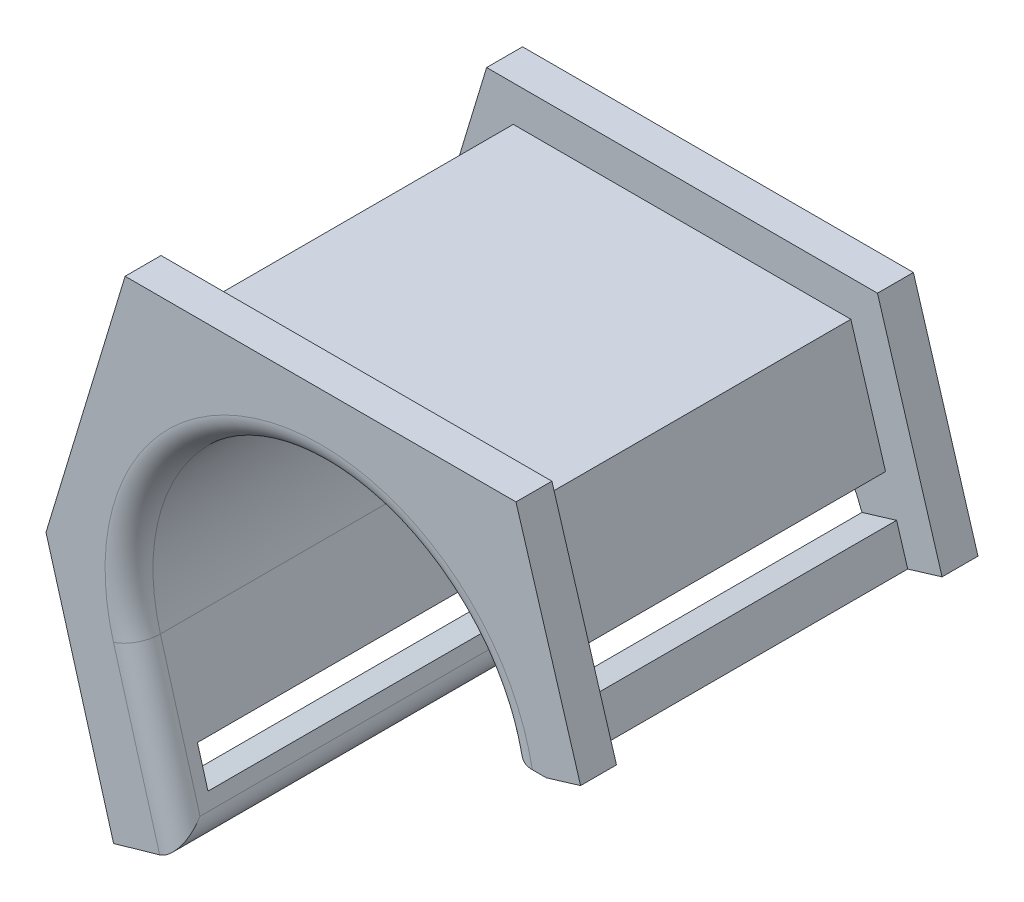
ISO-10303-21;
HEADER;
FILE_DESCRIPTION(('STEP AP214'),'2;1');
FILE_NAME('part.step','',(''),(''),'','','');
FILE_SCHEMA(('AUTOMOTIVE_DESIGN { 1 0 10303 214 1 1 1 1 }'));
ENDSEC;
DATA;
#1=APPLICATION_CONTEXT('core data for automotive mechanical design processes');
#2=APPLICATION_PROTOCOL_DEFINITION('international standard','automotive_design',2000,#1);
#3=PRODUCT_CONTEXT('',#1,'mechanical');
#4=PRODUCT('Part','Part','',(#3));
#5=PRODUCT_RELATED_PRODUCT_CATEGORY('part','',(#4));
#6=PRODUCT_DEFINITION_FORMATION('','',#4);
#7=PRODUCT_DEFINITION_CONTEXT('part definition',#1,'design');
#8=PRODUCT_DEFINITION('design','',#6,#7);
#9=PRODUCT_DEFINITION_SHAPE('','',#8);
#10=(LENGTH_UNIT() NAMED_UNIT(*) SI_UNIT(.MILLI.,.METRE.));
#11=(NAMED_UNIT(*) PLANE_ANGLE_UNIT() SI_UNIT($,.RADIAN.));
#12=(NAMED_UNIT(*) SI_UNIT($,.STERADIAN.) SOLID_ANGLE_UNIT());
#13=UNCERTAINTY_MEASURE_WITH_UNIT(LENGTH_MEASURE(1.E-05),#10,'distance_accuracy_value','');
#14=(GEOMETRIC_REPRESENTATION_CONTEXT(3) GLOBAL_UNCERTAINTY_ASSIGNED_CONTEXT((#13)) GLOBAL_UNIT_ASSIGNED_CONTEXT((#10,
#11,#12)) REPRESENTATION_CONTEXT('',''));
#15=CARTESIAN_POINT('',(0.,0.,0.));
#16=DIRECTION('',(0.,0.,1.));
#17=DIRECTION('',(1.,0.,0.));
#18=AXIS2_PLACEMENT_3D('',#15,#16,#17);
#19=CARTESIAN_POINT('',(107664.182909171,-375430.298410835,-30.4895421621525));
#20=DIRECTION('',(0.961247339593244,0.275687417422178,0.));
#21=DIRECTION('',(-0.275687417422178,0.961247339593244,0.));
#22=AXIS2_PLACEMENT_3D('',#19,#20,#21);
#23=PLANE('',#22);
#24=DIRECTION('',(-0.275687417422178,0.961247339593244,0.));
#25=VECTOR('',#24,1.);
#26=CARTESIAN_POINT('',(107664.182909171,-375430.298410835,15.1));
#27=LINE('',#26,#25);
#28=CARTESIAN_POINT('',(-7.20203780434758,-9.34776184271868,15.1));
#29=VERTEX_POINT('',#28);
#30=CARTESIAN_POINT('',(-7.64313767216152,-7.80976609922845,15.1));
#31=VERTEX_POINT('',#30);
#32=EDGE_CURVE('E265',#29,#31,#27,.T.);
#33=ORIENTED_EDGE('',*,*,#32,.T.);
#34=DIRECTION('',(0.,0.,1.));
#35=VECTOR('',#34,1.);
#36=CARTESIAN_POINT('',(-7.64313767212502,-7.80976609934137,15.1));
#37=LINE('',#36,#35);
#38=CARTESIAN_POINT('',(-7.64313767212502,-7.80976609934138,1.5));
#39=VERTEX_POINT('',#38);
#40=EDGE_CURVE('E250',#39,#31,#37,.T.);
#41=ORIENTED_EDGE('',*,*,#40,.F.);
#42=DIRECTION('',(0.275687417422178,-0.961247339593244,0.));
#43=VECTOR('',#42,1.);
#44=CARTESIAN_POINT('',(107664.182909171,-375430.298410835,1.5));
#45=LINE('',#44,#43);
#46=CARTESIAN_POINT('',(-7.20203780434758,-9.34776184271868,1.5));
#47=VERTEX_POINT('',#46);
#48=EDGE_CURVE('E300',#39,#47,#45,.T.);
#49=ORIENTED_EDGE('',*,*,#48,.T.);
#50=DIRECTION('',(0.,0.,1.));
#51=VECTOR('',#50,1.);
#52=CARTESIAN_POINT('',(-7.20203780434758,-9.34776184270447,-30.4895421621525));
#53=LINE('',#52,#51);
#54=EDGE_CURVE('E278',#47,#29,#53,.T.);
#55=ORIENTED_EDGE('',*,*,#54,.T.);
#56=EDGE_LOOP('',(#33,#41,#49,#55));
#57=FACE_BOUND('',#56,.T.);
#58=ADVANCED_FACE('F35',(#57),#23,.F.);
#59=CARTESIAN_POINT('',(114441.427485625,-378028.230173241,-30.4895421621525));
#60=DIRECTION('',(-0.957110448187778,-0.289723298976439,0.));
#61=DIRECTION('',(0.289723298976439,-0.957110448187778,0.));
#62=AXIS2_PLACEMENT_3D('',#59,#60,#61);
#63=PLANE('',#62);
#64=DIRECTION('',(-0.289723298976439,0.957110448187778,0.));
#65=VECTOR('',#64,1.);
#66=CARTESIAN_POINT('',(114441.427485625,-378028.230173241,1.5));
#67=LINE('',#66,#65);
#68=CARTESIAN_POINT('',(9.42573105153599,1.65169432477796,1.5));
#69=VERTEX_POINT('',#68);
#70=CARTESIAN_POINT('',(8.96217377317246,3.18307104191376,1.5));
#71=VERTEX_POINT('',#70);
#72=EDGE_CURVE('E279',#69,#71,#67,.T.);
#73=ORIENTED_EDGE('',*,*,#72,.T.);
#74=DIRECTION('',(0.,0.,-1.));
#75=VECTOR('',#74,1.);
#76=CARTESIAN_POINT('',(8.96217377317246,3.18307104191375,15.1));
#77=LINE('',#76,#75);
#78=CARTESIAN_POINT('',(8.96217377317246,3.18307104191375,15.1));
#79=VERTEX_POINT('',#78);
#80=EDGE_CURVE('E814',#79,#71,#77,.T.);
#81=ORIENTED_EDGE('',*,*,#80,.F.);
#82=DIRECTION('',(0.289723298976439,-0.957110448187778,0.));
#83=VECTOR('',#82,1.);
#84=CARTESIAN_POINT('',(114441.427485625,-378028.230173241,15.1));
#85=LINE('',#84,#83);
#86=CARTESIAN_POINT('',(9.42573105146494,1.65169432479217,15.1));
#87=VERTEX_POINT('',#86);
#88=EDGE_CURVE('E816',#79,#87,#85,.T.);
#89=ORIENTED_EDGE('',*,*,#88,.T.);
#90=DIRECTION('',(0.,0.,1.));
#91=VECTOR('',#90,1.);
#92=CARTESIAN_POINT('',(9.42573105146494,1.65169432479217,-30.4895421621525));
#93=LINE('',#92,#91);
#94=EDGE_CURVE('E304',#69,#87,#93,.T.);
#95=ORIENTED_EDGE('',*,*,#94,.F.);
#96=EDGE_LOOP('',(#73,#81,#89,#95));
#97=FACE_BOUND('',#96,.T.);
#98=ADVANCED_FACE('F515',(#97),#63,.F.);
#99=CARTESIAN_POINT('',(-7.20203780418057,-9.34776184266341,16.6));
#100=DIRECTION('',(-0.275687417422179,0.961247339593244,0.));
#101=DIRECTION('',(-0.961247339593244,-0.275687417422179,0.));
#102=AXIS2_PLACEMENT_3D('',#99,#100,#101);
#103=PLANE('',#102);
#104=DIRECTION('',(0.961247339593244,0.275687417422179,0.));
#105=VECTOR('',#104,1.);
#106=CARTESIAN_POINT('',(-7.20203780418057,-9.34776184266341,0.));
#107=LINE('',#106,#105);
#108=CARTESIAN_POINT('',(-8.64390881357044,-9.76129296879668,0.));
#109=VERTEX_POINT('',#108);
#110=CARTESIAN_POINT('',(-6.72141413438395,-9.20991813395232,0.));
#111=VERTEX_POINT('',#110);
#112=EDGE_CURVE('E369',#109,#111,#107,.T.);
#113=ORIENTED_EDGE('',*,*,#112,.T.);
#114=DIRECTION('',(0.,0.,-1.));
#115=VECTOR('',#114,1.);
#116=CARTESIAN_POINT('',(-6.72141413438395,-9.20991813395232,16.6));
#117=LINE('',#116,#115);
#118=CARTESIAN_POINT('',(-6.72141413438395,-9.20991813395232,16.6));
#119=VERTEX_POINT('',#118);
#120=EDGE_CURVE('E12',#111,#119,#117,.F.);
#121=ORIENTED_EDGE('',*,*,#120,.T.);
#122=DIRECTION('',(0.961247339593244,0.275687417422179,0.));
#123=VECTOR('',#122,1.);
#124=CARTESIAN_POINT('',(-7.20203780418057,-9.34776184266341,16.6));
#125=LINE('',#124,#123);
#126=CARTESIAN_POINT('',(-8.64390881357044,-9.76129296879668,16.6));
#127=VERTEX_POINT('',#126);
#128=EDGE_CURVE('E368',#127,#119,#125,.T.);
#129=ORIENTED_EDGE('',*,*,#128,.F.);
#130=DIRECTION('',(0.,0.,-1.));
#131=VECTOR('',#130,1.);
#132=CARTESIAN_POINT('',(-8.64390881357044,-9.76129296879668,47.0895421620494));
#133=LINE('',#132,#131);
#134=CARTESIAN_POINT('',(-8.64390881357044,-9.76129296879668,15.1));
#135=VERTEX_POINT('',#134);
#136=EDGE_CURVE('E355',#127,#135,#133,.T.);
#137=ORIENTED_EDGE('',*,*,#136,.T.);
#138=DIRECTION('',(0.961247339593244,0.275687417422179,0.));
#139=VECTOR('',#138,1.);
#140=CARTESIAN_POINT('',(292328.311987205,83832.9887136408,15.1));
#141=LINE('',#140,#139);
#142=EDGE_CURVE('E266',#135,#29,#141,.T.);
#143=ORIENTED_EDGE('',*,*,#142,.T.);
#144=ORIENTED_EDGE('',*,*,#54,.F.);
#145=DIRECTION('',(-0.961247339593244,-0.275687417422179,0.));
#146=VECTOR('',#145,1.);
#147=CARTESIAN_POINT('',(292328.311987205,83832.9887136408,1.5));
#148=LINE('',#147,#146);
#149=CARTESIAN_POINT('',(-8.64390881356769,-9.76129296884665,1.5));
#150=VERTEX_POINT('',#149);
#151=EDGE_CURVE('E297',#47,#150,#148,.T.);
#152=ORIENTED_EDGE('',*,*,#151,.T.);
#153=EDGE_CURVE('E319',#150,#109,#133,.T.);
#154=ORIENTED_EDGE('',*,*,#153,.T.);
#155=EDGE_LOOP('',(#113,#121,#129,#137,#143,#144,#152,#154));
#156=FACE_BOUND('',#155,.T.);
#157=ADVANCED_FACE('F422',(#156),#103,.F.);
#158=CARTESIAN_POINT('',(10.8613967238885,2.08627927332488,47.0895421620494));
#159=DIRECTION('',(-0.289723298976439,0.957110448187778,0.));
#160=DIRECTION('',(-0.957110448187778,-0.289723298976439,0.));
#161=AXIS2_PLACEMENT_3D('',#158,#159,#160);
#162=PLANE('',#161);
#163=DIRECTION('',(-0.957110448187778,-0.289723298976439,0.));
#164=VECTOR('',#163,1.);
#165=CARTESIAN_POINT('',(285567.695179607,86441.9199322144,1.5));
#166=LINE('',#165,#164);
#167=CARTESIAN_POINT('',(10.8613967238966,2.08627927328564,1.5));
#168=VERTEX_POINT('',#167);
#169=EDGE_CURVE('E282',#168,#69,#166,.T.);
#170=ORIENTED_EDGE('',*,*,#169,.T.);
#171=DIRECTION('',(0.,0.,-1.));
#172=VECTOR('',#171,1.);
#173=CARTESIAN_POINT('',(9.42573105160679,1.65169432486022,16.6));
#174=LINE('',#173,#172);
#175=CARTESIAN_POINT('',(9.42573105160679,1.65169432486022,0.));
#176=VERTEX_POINT('',#175);
#177=EDGE_CURVE('E377',#69,#176,#174,.T.);
#178=ORIENTED_EDGE('',*,*,#177,.T.);
#179=DIRECTION('',(0.957110448187778,0.289723298976439,0.));
#180=VECTOR('',#179,1.);
#181=CARTESIAN_POINT('',(10.8613967238885,2.08627927332488,0.));
#182=LINE('',#181,#180);
#183=CARTESIAN_POINT('',(10.8613967238885,2.08627927332488,0.));
#184=VERTEX_POINT('',#183);
#185=EDGE_CURVE('E315',#176,#184,#182,.T.);
#186=ORIENTED_EDGE('',*,*,#185,.T.);
#187=DIRECTION('',(0.,0.,-1.));
#188=VECTOR('',#187,1.);
#189=CARTESIAN_POINT('',(10.8613967238885,2.08627927332488,47.0895421620494));
#190=LINE('',#189,#188);
#191=EDGE_CURVE('E338',#168,#184,#190,.T.);
#192=ORIENTED_EDGE('',*,*,#191,.F.);
#193=EDGE_LOOP('',(#170,#178,#186,#192));
#194=FACE_BOUND('',#193,.T.);
#195=ADVANCED_FACE('F486',(#194),#162,.F.);
#196=CARTESIAN_POINT('',(10.8613967238885,2.08627927332488,47.0895421620494));
#197=DIRECTION('',(-0.957110448187778,-0.289723298976438,0.));
#198=DIRECTION('',(0.289723298976438,-0.957110448187778,0.));
#199=AXIS2_PLACEMENT_3D('',#196,#197,#198);
#200=PLANE('',#199);
#201=DIRECTION('',(0.289723298976439,-0.957110448187778,0.));
#202=VECTOR('',#201,1.);
#203=CARTESIAN_POINT('',(114442.863151297,-378027.795588293,1.5));
#204=LINE('',#203,#202);
#205=CARTESIAN_POINT('',(8.16315789477073,10.9999999999673,1.5));
#206=VERTEX_POINT('',#205);
#207=EDGE_CURVE('E285',#206,#168,#204,.T.);
#208=ORIENTED_EDGE('',*,*,#207,.T.);
#209=ORIENTED_EDGE('',*,*,#191,.T.);
#210=DIRECTION('',(-0.289723298976438,0.957110448187778,0.));
#211=VECTOR('',#210,1.);
#212=CARTESIAN_POINT('',(10.8613967238885,2.08627927332488,0.));
#213=LINE('',#212,#211);
#214=CARTESIAN_POINT('',(8.16315789473684,11.,0.));
#215=VERTEX_POINT('',#214);
#216=EDGE_CURVE('E331',#184,#215,#213,.T.);
#217=ORIENTED_EDGE('',*,*,#216,.T.);
#218=DIRECTION('',(0.,0.,-1.));
#219=VECTOR('',#218,1.);
#220=CARTESIAN_POINT('',(8.16315789473684,11.,47.0895421620494));
#221=LINE('',#220,#219);
#222=EDGE_CURVE('E334',#206,#215,#221,.T.);
#223=ORIENTED_EDGE('',*,*,#222,.F.);
#224=EDGE_LOOP('',(#208,#209,#217,#223));
#225=FACE_BOUND('',#224,.T.);
#226=ADVANCED_FACE('F721',(#225),#200,.F.);
#227=CARTESIAN_POINT('',(8.16315789473684,11.,47.0895421620494));
#228=DIRECTION('',(0.,-1.,0.));
#229=DIRECTION('',(0.,0.,-1.));
#230=AXIS2_PLACEMENT_3D('',#227,#228,#229);
#231=PLANE('',#230);
#232=DIRECTION('',(1.,0.,0.));
#233=VECTOR('',#232,1.);
#234=CARTESIAN_POINT('',(399999.696934181,11.0000000000241,1.5));
#235=LINE('',#234,#233);
#236=CARTESIAN_POINT('',(-8.1631578947281,11.0000000000241,1.5));
#237=VERTEX_POINT('',#236);
#238=EDGE_CURVE('E288',#237,#206,#235,.T.);
#239=ORIENTED_EDGE('',*,*,#238,.T.);
#240=ORIENTED_EDGE('',*,*,#222,.T.);
#241=DIRECTION('',(-1.,0.,0.));
#242=VECTOR('',#241,1.);
#243=CARTESIAN_POINT('',(8.16315789473684,11.,0.));
#244=LINE('',#243,#242);
#245=CARTESIAN_POINT('',(-8.16315789473684,11.,0.));
#246=VERTEX_POINT('',#245);
#247=EDGE_CURVE('E326',#215,#246,#244,.T.);
#248=ORIENTED_EDGE('',*,*,#247,.T.);
#249=DIRECTION('',(0.,0.,-1.));
#250=VECTOR('',#249,1.);
#251=CARTESIAN_POINT('',(-8.16315789473684,11.,47.0895421620494));
#252=LINE('',#251,#250);
#253=EDGE_CURVE('E329',#237,#246,#252,.T.);
#254=ORIENTED_EDGE('',*,*,#253,.F.);
#255=EDGE_LOOP('',(#239,#240,#248,#254));
#256=FACE_BOUND('',#255,.T.);
#257=ADVANCED_FACE('F547',(#256),#231,.F.);
#258=CARTESIAN_POINT('',(-8.16315789473684,11.,47.0895421620494));
#259=DIRECTION('',(0.957110448187778,-0.289723298976438,0.));
#260=DIRECTION('',(0.289723298976438,0.957110448187778,0.));
#261=AXIS2_PLACEMENT_3D('',#258,#259,#260);
#262=PLANE('',#261);
#263=DIRECTION('',(0.289723298976438,0.957110448187778,0.));
#264=VECTOR('',#263,1.);
#265=CARTESIAN_POINT('',(-47291.2420539061,-156190.206439872,1.5));
#266=LINE('',#265,#264);
#267=CARTESIAN_POINT('',(-11.4675283625161,0.0839034673276728,1.5));
#268=VERTEX_POINT('',#267);
#269=EDGE_CURVE('E291',#268,#237,#266,.T.);
#270=ORIENTED_EDGE('',*,*,#269,.T.);
#271=ORIENTED_EDGE('',*,*,#253,.T.);
#272=DIRECTION('',(-0.289723298976438,-0.957110448187778,0.));
#273=VECTOR('',#272,1.);
#274=CARTESIAN_POINT('',(-8.16315789473684,11.,0.));
#275=LINE('',#274,#273);
#276=CARTESIAN_POINT('',(-11.4675283625365,0.0839034672478182,0.));
#277=VERTEX_POINT('',#276);
#278=EDGE_CURVE('E321',#246,#277,#275,.T.);
#279=ORIENTED_EDGE('',*,*,#278,.T.);
#280=DIRECTION('',(0.,0.,-1.));
#281=VECTOR('',#280,1.);
#282=CARTESIAN_POINT('',(-11.4675283625365,0.0839034672478182,47.0895421620494));
#283=LINE('',#282,#281);
#284=EDGE_CURVE('E324',#268,#277,#283,.T.);
#285=ORIENTED_EDGE('',*,*,#284,.F.);
#286=EDGE_LOOP('',(#270,#271,#279,#285));
#287=FACE_BOUND('',#286,.T.);
#288=ADVANCED_FACE('F541',(#287),#262,.F.);
#289=CARTESIAN_POINT('',(-11.4675283625365,0.0839034672478182,47.0895421620494));
#290=DIRECTION('',(0.961247339593244,0.275687417422178,0.));
#291=DIRECTION('',(-0.275687417422178,0.961247339593244,0.));
#292=AXIS2_PLACEMENT_3D('',#289,#290,#291);
#293=PLANE('',#292);
#294=DIRECTION('',(-0.275687417422178,0.961247339593244,0.));
#295=VECTOR('',#294,1.);
#296=CARTESIAN_POINT('',(107662.741038161,-375430.711941961,1.5));
#297=LINE('',#296,#295);
#298=EDGE_CURVE('E294',#150,#268,#297,.T.);
#299=ORIENTED_EDGE('',*,*,#298,.T.);
#300=ORIENTED_EDGE('',*,*,#284,.T.);
#301=DIRECTION('',(0.275687417422178,-0.961247339593244,0.));
#302=VECTOR('',#301,1.);
#303=CARTESIAN_POINT('',(-11.4675283625365,0.0839034672478182,0.));
#304=LINE('',#303,#302);
#305=EDGE_CURVE('E316',#277,#109,#304,.T.);
#306=ORIENTED_EDGE('',*,*,#305,.T.);
#307=ORIENTED_EDGE('',*,*,#153,.F.);
#308=EDGE_LOOP('',(#299,#300,#306,#307));
#309=FACE_BOUND('',#308,.T.);
#310=ADVANCED_FACE('F420',(#309),#293,.F.);
#311=CARTESIAN_POINT('',(9.42573105160679,1.65169432486022,16.6));
#312=DIRECTION('',(0.,1.,0.));
#313=DIRECTION('',(-1.,0.,0.));
#314=AXIS2_PLACEMENT_3D('',#311,#312,#313);
#315=PLANE('',#314);
#316=DIRECTION('',(1.,0.,0.));
#317=VECTOR('',#316,1.);
#318=CARTESIAN_POINT('',(9.42573105160679,1.65169432486022,16.6));
#319=LINE('',#318,#317);
#320=CARTESIAN_POINT('',(8.84714111208952,1.65169432486022,16.6));
#321=VERTEX_POINT('',#320);
#322=CARTESIAN_POINT('',(9.42573105160679,1.65169432486022,16.6));
#323=VERTEX_POINT('',#322);
#324=EDGE_CURVE('E366',#321,#323,#319,.T.);
#325=ORIENTED_EDGE('',*,*,#324,.F.);
#326=CARTESIAN_POINT('',(8.84714111208952,1.65169432486022,16.6));
#327=CARTESIAN_POINT('',(8.80543519296856,1.65169432486022,16.5999815079966));
#328=CARTESIAN_POINT('',(8.76402836919657,1.65169432486022,16.5974882051744));
#329=CARTESIAN_POINT('',(8.68181305802902,1.65169432486022,16.5875519954981));
#330=CARTESIAN_POINT('',(8.64100456851359,1.65169432486022,16.5801091061847));
#331=CARTESIAN_POINT('',(8.60049517222724,1.65169432486022,16.5701914235928));
#332=B_SPLINE_CURVE_WITH_KNOTS('',3,(#326,#327,#328,#329,#330,#331),.UNSPECIFIED.,.F.,.F.,(4,2,
4),(0.,0.124445468075917,0.248890495139165),.UNSPECIFIED.);
#333=CARTESIAN_POINT('',(8.60049517222724,1.65169432486022,16.5701914235928));
#334=VERTEX_POINT('',#333);
#335=EDGE_CURVE('E405',#321,#334,#332,.T.);
#336=ORIENTED_EDGE('',*,*,#335,.T.);
#337=DIRECTION('',(0.,0.,-1.));
#338=VECTOR('',#337,1.);
#339=CARTESIAN_POINT('',(8.60049517222724,1.65169432486022,16.6));
#340=LINE('',#339,#338);
#341=CARTESIAN_POINT('',(8.60049517222724,1.65169432486022,0.0298085764071573));
#342=VERTEX_POINT('',#341);
#343=EDGE_CURVE('E397',#334,#342,#340,.T.);
#344=ORIENTED_EDGE('',*,*,#343,.T.);
#345=CARTESIAN_POINT('',(8.60049517222724,1.65169432486022,0.0298085764071581));
#346=CARTESIAN_POINT('',(8.64100456851359,1.65169432486022,0.0198908938153402));
#347=CARTESIAN_POINT('',(8.68181305802902,1.65169432486022,0.0124480045018923));
#348=CARTESIAN_POINT('',(8.76402836919657,1.65169432486022,0.00251179482562299));
#349=CARTESIAN_POINT('',(8.80543519296856,1.65169432486022,1.84920033517682E-05));
#350=CARTESIAN_POINT('',(8.84714111208952,1.65169432486022,0.));
#351=B_SPLINE_CURVE_WITH_KNOTS('',3,(#345,#346,#347,#348,#349,#350),.UNSPECIFIED.,.F.,.F.,(4,2,
4),(0.,0.124445027063247,0.248890495139165),.UNSPECIFIED.);
#352=CARTESIAN_POINT('',(8.84714111208952,1.65169432486022,0.));
#353=VERTEX_POINT('',#352);
#354=EDGE_CURVE('E399',#342,#353,#351,.T.);
#355=ORIENTED_EDGE('',*,*,#354,.T.);
#356=DIRECTION('',(1.,0.,0.));
#357=VECTOR('',#356,1.);
#358=CARTESIAN_POINT('',(9.42573105160679,1.65169432486022,0.));
#359=LINE('',#358,#357);
#360=EDGE_CURVE('E342',#353,#176,#359,.T.);
#361=ORIENTED_EDGE('',*,*,#360,.T.);
#362=ORIENTED_EDGE('',*,*,#177,.F.);
#363=ORIENTED_EDGE('',*,*,#94,.T.);
#364=EDGE_CURVE('E378',#323,#87,#174,.T.);
#365=ORIENTED_EDGE('',*,*,#364,.F.);
#366=EDGE_LOOP('',(#325,#336,#344,#355,#361,#362,#363,#365));
#367=FACE_BOUND('',#366,.T.);
#368=ADVANCED_FACE('F414',(#367),#315,.F.);
#369=CARTESIAN_POINT('',(-5.76016679479071,-8.93423071653014,16.6));
#370=DIRECTION('',(-0.961247339593244,-0.275687417422178,0.));
#371=DIRECTION('',(0.275687417422178,-0.961247339593244,0.));
#372=AXIS2_PLACEMENT_3D('',#369,#370,#371);
#373=PLANE('',#372);
#374=DIRECTION('',(0.,0.,-1.));
#375=VECTOR('',#374,1.);
#376=CARTESIAN_POINT('',(-7.68997871674596,-2.20549933937742,16.6));
#377=LINE('',#376,#375);
#378=CARTESIAN_POINT('',(-7.68997871674596,-2.20549933937742,15.6));
#379=VERTEX_POINT('',#378);
#380=CARTESIAN_POINT('',(-7.68997871674596,-2.20549933937742,1.));
#381=VERTEX_POINT('',#380);
#382=EDGE_CURVE('E372',#379,#381,#377,.T.);
#383=ORIENTED_EDGE('',*,*,#382,.F.);
#384=DIRECTION('',(-0.275687417422178,0.961247339593244,0.));
#385=VECTOR('',#384,1.);
#386=CARTESIAN_POINT('',(-5.76016679479071,-8.93423071653014,15.6));
#387=LINE('',#386,#385);
#388=CARTESIAN_POINT('',(-6.03585421221288,-7.9729833769369,15.6));
#389=VERTEX_POINT('',#388);
#390=EDGE_CURVE('E390',#379,#389,#387,.F.);
#391=ORIENTED_EDGE('',*,*,#390,.T.);
#392=DIRECTION('',(0.,0.,-1.));
#393=VECTOR('',#392,1.);
#394=CARTESIAN_POINT('',(-6.03585421221288,-7.9729833769369,16.6));
#395=LINE('',#394,#393);
#396=CARTESIAN_POINT('',(-6.03585421221288,-7.9729833769369,1.));
#397=VERTEX_POINT('',#396);
#398=EDGE_CURVE('E386',#389,#397,#395,.T.);
#399=ORIENTED_EDGE('',*,*,#398,.T.);
#400=DIRECTION('',(-0.275687417422178,0.961247339593244,0.));
#401=VECTOR('',#400,1.);
#402=CARTESIAN_POINT('',(-5.76016679479071,-8.93423071653014,1.));
#403=LINE('',#402,#401);
#404=EDGE_CURVE('E388',#397,#381,#403,.T.);
#405=ORIENTED_EDGE('',*,*,#404,.T.);
#406=EDGE_LOOP('',(#383,#391,#399,#405));
#407=FACE_BOUND('',#406,.T.);
#408=DIRECTION('',(0.,0.,-1.));
#409=VECTOR('',#408,1.);
#410=CARTESIAN_POINT('',(-6.20126666266423,-7.39623497318777,15.1));
#411=LINE('',#410,#409);
#412=CARTESIAN_POINT('',(-6.20126666266423,-7.39623497318777,15.1));
#413=VERTEX_POINT('',#412);
#414=CARTESIAN_POINT('',(-6.20126666266423,-7.39623497318777,1.5));
#415=VERTEX_POINT('',#414);
#416=EDGE_CURVE('E867',#413,#415,#411,.T.);
#417=ORIENTED_EDGE('',*,*,#416,.F.);
#418=DIRECTION('',(0.275687417422178,-0.961247339593244,0.));
#419=VECTOR('',#418,1.);
#420=CARTESIAN_POINT('',(-6.64236653053972,-5.85823922983857,15.1));
#421=LINE('',#420,#419);
#422=CARTESIAN_POINT('',(-6.64236653053972,-5.85823922983858,15.1));
#423=VERTEX_POINT('',#422);
#424=EDGE_CURVE('E856',#423,#413,#421,.T.);
#425=ORIENTED_EDGE('',*,*,#424,.F.);
#426=DIRECTION('',(0.,0.,1.));
#427=VECTOR('',#426,1.);
#428=CARTESIAN_POINT('',(-6.64236653053972,-5.85823922983858,15.1));
#429=LINE('',#428,#427);
#430=CARTESIAN_POINT('',(-6.64236653053972,-5.85823922983858,1.5));
#431=VERTEX_POINT('',#430);
#432=EDGE_CURVE('E245',#431,#423,#429,.T.);
#433=ORIENTED_EDGE('',*,*,#432,.F.);
#434=DIRECTION('',(-0.275687417422178,0.961247339593244,0.));
#435=VECTOR('',#434,1.);
#436=CARTESIAN_POINT('',(-6.64236653053972,-5.85823922983858,1.5));
#437=LINE('',#436,#435);
#438=EDGE_CURVE('E864',#415,#431,#437,.T.);
#439=ORIENTED_EDGE('',*,*,#438,.F.);
#440=EDGE_LOOP('',(#417,#425,#433,#439));
#441=FACE_BOUND('',#440,.T.);
#442=ADVANCED_FACE('F419',(#407,#441),#373,.F.);
#443=CARTESIAN_POINT('',(0.,0.,16.6));
#444=DIRECTION('',(0.,0.,-1.));
#445=DIRECTION('',(-1.,0.,0.));
#446=AXIS2_PLACEMENT_3D('',#443,#444,#445);
#447=CYLINDRICAL_SURFACE('',#446,8.);
#448=CARTESIAN_POINT('',(0.,0.,15.1));
#449=DIRECTION('',(0.,0.,1.));
#450=DIRECTION('',(1.,0.,0.));
#451=AXIS2_PLACEMENT_3D('',#448,#449,#450);
#452=CIRCLE('',#451,8.);
#453=CARTESIAN_POINT('',(7.51438507476058,2.74481637786854,15.1));
#454=VERTEX_POINT('',#453);
#455=CARTESIAN_POINT('',(6.807291620197,4.20247317630888,15.1));
#456=VERTEX_POINT('',#455);
#457=EDGE_CURVE('E818',#454,#456,#452,.T.);
#458=ORIENTED_EDGE('',*,*,#457,.F.);
#459=DIRECTION('',(0.,0.,-1.));
#460=VECTOR('',#459,1.);
#461=CARTESIAN_POINT('',(7.51438507476058,2.74481637786854,16.6));
#462=LINE('',#461,#460);
#463=CARTESIAN_POINT('',(7.51438507476058,2.74481637786855,1.5));
#464=VERTEX_POINT('',#463);
#465=EDGE_CURVE('E841',#464,#454,#462,.F.);
#466=ORIENTED_EDGE('',*,*,#465,.F.);
#467=CARTESIAN_POINT('',(0.,0.,1.5));
#468=DIRECTION('',(0.,0.,-1.));
#469=DIRECTION('',(-1.,0.,0.));
#470=AXIS2_PLACEMENT_3D('',#467,#468,#469);
#471=CIRCLE('',#470,8.);
#472=CARTESIAN_POINT('',(6.807291620197,4.20247317630888,1.5));
#473=VERTEX_POINT('',#472);
#474=EDGE_CURVE('E843',#473,#464,#471,.T.);
#475=ORIENTED_EDGE('',*,*,#474,.F.);
#476=DIRECTION('',(0.,0.,-1.));
#477=VECTOR('',#476,1.);
#478=CARTESIAN_POINT('',(6.807291620197,4.20247317630888,16.6));
#479=LINE('',#478,#477);
#480=EDGE_CURVE('E852',#456,#473,#479,.T.);
#481=ORIENTED_EDGE('',*,*,#480,.F.);
#482=EDGE_LOOP('',(#458,#466,#475,#481));
#483=FACE_BOUND('',#482,.T.);
#484=DIRECTION('',(0.,0.,-1.));
#485=VECTOR('',#484,1.);
#486=CARTESIAN_POINT('',(7.64488459753533,2.35706162209798,16.6));
#487=LINE('',#486,#485);
#488=CARTESIAN_POINT('',(7.64488459753533,2.35706162209798,1.));
#489=VERTEX_POINT('',#488);
#490=CARTESIAN_POINT('',(7.64488459753533,2.35706162209798,15.6));
#491=VERTEX_POINT('',#490);
#492=EDGE_CURVE('E52',#489,#491,#487,.F.);
#493=ORIENTED_EDGE('',*,*,#492,.T.);
#494=CARTESIAN_POINT('',(0.,0.,15.6));
#495=DIRECTION('',(0.,0.,1.));
#496=DIRECTION('',(1.,0.,0.));
#497=AXIS2_PLACEMENT_3D('',#494,#495,#496);
#498=CIRCLE('',#497,8.);
#499=EDGE_CURVE('E44',#491,#379,#498,.T.);
#500=ORIENTED_EDGE('',*,*,#499,.T.);
#501=ORIENTED_EDGE('',*,*,#382,.T.);
#502=CARTESIAN_POINT('',(0.,0.,1.));
#503=DIRECTION('',(0.,0.,1.));
#504=DIRECTION('',(1.,0.,0.));
#505=AXIS2_PLACEMENT_3D('',#502,#503,#504);
#506=CIRCLE('',#505,8.);
#507=EDGE_CURVE('E57',#381,#489,#506,.F.);
#508=ORIENTED_EDGE('',*,*,#507,.T.);
#509=EDGE_LOOP('',(#493,#500,#501,#508));
#510=FACE_BOUND('',#509,.T.);
#511=ADVANCED_FACE('F503',(#483,#510),#447,.F.);
#512=CARTESIAN_POINT('',(0.,0.,16.6));
#513=DIRECTION('',(0.,0.,1.));
#514=DIRECTION('',(1.,0.,0.));
#515=AXIS2_PLACEMENT_3D('',#512,#513,#514);
#516=PLANE('',#515);
#517=ORIENTED_EDGE('',*,*,#128,.T.);
#518=DIRECTION('',(-0.275687417422178,0.961247339593244,0.));
#519=VECTOR('',#518,1.);
#520=CARTESIAN_POINT('',(-8.6512260563392,-2.4811867567996,16.6));
#521=LINE('',#520,#519);
#522=CARTESIAN_POINT('',(-8.6512260563392,-2.4811867567996,16.6));
#523=VERTEX_POINT('',#522);
#524=EDGE_CURVE('E383',#119,#523,#521,.T.);
#525=ORIENTED_EDGE('',*,*,#524,.T.);
#526=CARTESIAN_POINT('',(0.,0.,16.6));
#527=DIRECTION('',(0.,0.,1.));
#528=DIRECTION('',(1.,0.,0.));
#529=AXIS2_PLACEMENT_3D('',#526,#527,#528);
#530=CIRCLE('',#529,9.);
#531=EDGE_CURVE('E381',#523,#321,#530,.F.);
#532=ORIENTED_EDGE('',*,*,#531,.T.);
#533=ORIENTED_EDGE('',*,*,#324,.T.);
#534=DIRECTION('',(0.957110448187778,0.289723298976439,0.));
#535=VECTOR('',#534,1.);
#536=CARTESIAN_POINT('',(10.8613967238885,2.08627927332488,16.6));
#537=LINE('',#536,#535);
#538=CARTESIAN_POINT('',(10.8613967238885,2.08627927332488,16.6));
#539=VERTEX_POINT('',#538);
#540=EDGE_CURVE('E352',#323,#539,#537,.T.);
#541=ORIENTED_EDGE('',*,*,#540,.T.);
#542=DIRECTION('',(-0.289723298976438,0.957110448187778,0.));
#543=VECTOR('',#542,1.);
#544=CARTESIAN_POINT('',(10.8613967238885,2.08627927332488,16.6));
#545=LINE('',#544,#543);
#546=CARTESIAN_POINT('',(8.16315789473684,11.,16.6));
#547=VERTEX_POINT('',#546);
#548=EDGE_CURVE('E349',#539,#547,#545,.T.);
#549=ORIENTED_EDGE('',*,*,#548,.T.);
#550=DIRECTION('',(-1.,0.,0.));
#551=VECTOR('',#550,1.);
#552=CARTESIAN_POINT('',(8.16315789473684,11.,16.6));
#553=LINE('',#552,#551);
#554=CARTESIAN_POINT('',(-8.16315789473684,11.,16.6));
#555=VERTEX_POINT('',#554);
#556=EDGE_CURVE('E346',#547,#555,#553,.T.);
#557=ORIENTED_EDGE('',*,*,#556,.T.);
#558=DIRECTION('',(-0.289723298976438,-0.957110448187778,0.));
#559=VECTOR('',#558,1.);
#560=CARTESIAN_POINT('',(-8.16315789473684,11.,16.6));
#561=LINE('',#560,#559);
#562=CARTESIAN_POINT('',(-11.4675283625365,0.0839034672478182,16.6));
#563=VERTEX_POINT('',#562);
#564=EDGE_CURVE('E343',#555,#563,#561,.T.);
#565=ORIENTED_EDGE('',*,*,#564,.T.);
#566=DIRECTION('',(0.275687417422178,-0.961247339593244,0.));
#567=VECTOR('',#566,1.);
#568=CARTESIAN_POINT('',(-11.4675283625365,0.0839034672478182,16.6));
#569=LINE('',#568,#567);
#570=EDGE_CURVE('E339',#563,#127,#569,.T.);
#571=ORIENTED_EDGE('',*,*,#570,.T.);
#572=EDGE_LOOP('',(#517,#525,#532,#533,#541,#549,#557,#565,#571));
#573=FACE_BOUND('',#572,.T.);
#574=ADVANCED_FACE('F497',(#573),#516,.T.);
#575=CARTESIAN_POINT('',(0.,0.,0.));
#576=DIRECTION('',(0.,0.,1.));
#577=DIRECTION('',(1.,0.,0.));
#578=AXIS2_PLACEMENT_3D('',#575,#576,#577);
#579=PLANE('',#578);
#580=CARTESIAN_POINT('',(0.,0.,0.));
#581=DIRECTION('',(0.,0.,1.));
#582=DIRECTION('',(1.,0.,0.));
#583=AXIS2_PLACEMENT_3D('',#580,#581,#582);
#584=CIRCLE('',#583,9.);
#585=CARTESIAN_POINT('',(-8.6512260563392,-2.4811867567996,0.));
#586=VERTEX_POINT('',#585);
#587=EDGE_CURVE('E393',#353,#586,#584,.T.);
#588=ORIENTED_EDGE('',*,*,#587,.T.);
#589=DIRECTION('',(-0.275687417422178,0.961247339593244,0.));
#590=VECTOR('',#589,1.);
#591=CARTESIAN_POINT('',(-8.6512260563392,-2.4811867567996,0.));
#592=LINE('',#591,#590);
#593=EDGE_CURVE('E395',#586,#111,#592,.F.);
#594=ORIENTED_EDGE('',*,*,#593,.T.);
#595=ORIENTED_EDGE('',*,*,#112,.F.);
#596=ORIENTED_EDGE('',*,*,#305,.F.);
#597=ORIENTED_EDGE('',*,*,#278,.F.);
#598=ORIENTED_EDGE('',*,*,#247,.F.);
#599=ORIENTED_EDGE('',*,*,#216,.F.);
#600=ORIENTED_EDGE('',*,*,#185,.F.);
#601=ORIENTED_EDGE('',*,*,#360,.F.);
#602=EDGE_LOOP('',(#588,#594,#595,#596,#597,#598,#599,#600,#601));
#603=FACE_BOUND('',#602,.T.);
#604=ADVANCED_FACE('F481',(#603),#579,.F.);
#605=ORIENTED_EDGE('',*,*,#364,.T.);
#606=DIRECTION('',(0.957110448187778,0.289723298976439,0.));
#607=VECTOR('',#606,1.);
#608=CARTESIAN_POINT('',(285567.695179607,86441.9199322144,15.1));
#609=LINE('',#608,#607);
#610=CARTESIAN_POINT('',(10.8613967238966,2.08627927338512,15.1));
#611=VERTEX_POINT('',#610);
#612=EDGE_CURVE('E495',#87,#611,#609,.T.);
#613=ORIENTED_EDGE('',*,*,#612,.T.);
#614=EDGE_CURVE('E335',#539,#611,#190,.T.);
#615=ORIENTED_EDGE('',*,*,#614,.F.);
#616=ORIENTED_EDGE('',*,*,#540,.F.);
#617=EDGE_LOOP('',(#605,#613,#615,#616));
#618=FACE_BOUND('',#617,.T.);
#619=ADVANCED_FACE('F492',(#618),#162,.F.);
#620=ORIENTED_EDGE('',*,*,#614,.T.);
#621=DIRECTION('',(-0.289723298976439,0.957110448187778,0.));
#622=VECTOR('',#621,1.);
#623=CARTESIAN_POINT('',(114442.863151297,-378027.795588293,15.1));
#624=LINE('',#623,#622);
#625=CARTESIAN_POINT('',(8.1631578947281,11.0000000000241,15.1));
#626=VERTEX_POINT('',#625);
#627=EDGE_CURVE('E830',#611,#626,#624,.T.);
#628=ORIENTED_EDGE('',*,*,#627,.T.);
#629=EDGE_CURVE('E330',#547,#626,#221,.T.);
#630=ORIENTED_EDGE('',*,*,#629,.F.);
#631=ORIENTED_EDGE('',*,*,#548,.F.);
#632=EDGE_LOOP('',(#620,#628,#630,#631));
#633=FACE_BOUND('',#632,.T.);
#634=ADVANCED_FACE('F709',(#633),#200,.F.);
#635=ORIENTED_EDGE('',*,*,#629,.T.);
#636=DIRECTION('',(-1.,0.,0.));
#637=VECTOR('',#636,1.);
#638=CARTESIAN_POINT('',(399999.696934181,11.0000000000241,15.1));
#639=LINE('',#638,#637);
#640=CARTESIAN_POINT('',(-8.163157894721,11.0000000000525,15.1));
#641=VERTEX_POINT('',#640);
#642=EDGE_CURVE('E833',#626,#641,#639,.T.);
#643=ORIENTED_EDGE('',*,*,#642,.T.);
#644=EDGE_CURVE('E325',#555,#641,#252,.T.);
#645=ORIENTED_EDGE('',*,*,#644,.F.);
#646=ORIENTED_EDGE('',*,*,#556,.F.);
#647=EDGE_LOOP('',(#635,#643,#645,#646));
#648=FACE_BOUND('',#647,.T.);
#649=ADVANCED_FACE('F538',(#648),#231,.F.);
#650=ORIENTED_EDGE('',*,*,#644,.T.);
#651=DIRECTION('',(-0.289723298976438,-0.957110448187778,0.));
#652=VECTOR('',#651,1.);
#653=CARTESIAN_POINT('',(-47291.2420539061,-156190.206439872,15.1));
#654=LINE('',#653,#652);
#655=CARTESIAN_POINT('',(-11.4675283625871,0.0839034673276728,15.1));
#656=VERTEX_POINT('',#655);
#657=EDGE_CURVE('E836',#641,#656,#654,.T.);
#658=ORIENTED_EDGE('',*,*,#657,.T.);
#659=EDGE_CURVE('E320',#563,#656,#283,.T.);
#660=ORIENTED_EDGE('',*,*,#659,.F.);
#661=ORIENTED_EDGE('',*,*,#564,.F.);
#662=EDGE_LOOP('',(#650,#658,#660,#661));
#663=FACE_BOUND('',#662,.T.);
#664=ADVANCED_FACE('F533',(#663),#262,.F.);
#665=ORIENTED_EDGE('',*,*,#659,.T.);
#666=DIRECTION('',(0.275687417422178,-0.961247339593244,0.));
#667=VECTOR('',#666,1.);
#668=CARTESIAN_POINT('',(107662.741038161,-375430.711941961,15.1));
#669=LINE('',#668,#667);
#670=EDGE_CURVE('E313',#656,#135,#669,.T.);
#671=ORIENTED_EDGE('',*,*,#670,.T.);
#672=ORIENTED_EDGE('',*,*,#136,.F.);
#673=ORIENTED_EDGE('',*,*,#570,.F.);
#674=EDGE_LOOP('',(#665,#671,#672,#673));
#675=FACE_BOUND('',#674,.T.);
#676=ADVANCED_FACE('F526',(#675),#293,.F.);
#677=CARTESIAN_POINT('',(-9.90377449490154,0.0724620854555269,1.5));
#678=VERTEX_POINT('',#677);
#679=CARTESIAN_POINT('',(-8.08423754000051,-6.27177035599219,1.5));
#680=VERTEX_POINT('',#679);
#681=EDGE_CURVE('E258',#678,#680,#45,.T.);
#682=ORIENTED_EDGE('',*,*,#681,.T.);
#683=DIRECTION('',(0.,0.,-1.));
#684=VECTOR('',#683,1.);
#685=CARTESIAN_POINT('',(-8.08423754000051,-6.27177035599218,15.1));
#686=LINE('',#685,#684);
#687=CARTESIAN_POINT('',(-8.08423754000051,-6.27177035599218,15.1));
#688=VERTEX_POINT('',#687);
#689=EDGE_CURVE('E242',#688,#680,#686,.T.);
#690=ORIENTED_EDGE('',*,*,#689,.F.);
#691=CARTESIAN_POINT('',(-9.90377449489444,0.0724620854839486,15.1));
#692=VERTEX_POINT('',#691);
#693=EDGE_CURVE('E255',#688,#692,#27,.T.);
#694=ORIENTED_EDGE('',*,*,#693,.T.);
#695=DIRECTION('',(0.,0.,1.));
#696=VECTOR('',#695,1.);
#697=CARTESIAN_POINT('',(-9.90377449489444,0.0724620854839486,-30.4895421621525));
#698=LINE('',#697,#696);
#699=EDGE_CURVE('E311',#678,#692,#698,.T.);
#700=ORIENTED_EDGE('',*,*,#699,.F.);
#701=EDGE_LOOP('',(#682,#690,#694,#700));
#702=FACE_BOUND('',#701,.T.);
#703=ADVANCED_FACE('F253',(#702),#23,.F.);
#704=CARTESIAN_POINT('',(7.04999999990719,9.50000000000273,15.1));
#705=VERTEX_POINT('',#704);
#706=CARTESIAN_POINT('',(8.49861649479733,4.71444775903436,15.1));
#707=VERTEX_POINT('',#706);
#708=EDGE_CURVE('E823',#705,#707,#85,.T.);
#709=ORIENTED_EDGE('',*,*,#708,.T.);
#710=DIRECTION('',(0.,0.,1.));
#711=VECTOR('',#710,1.);
#712=CARTESIAN_POINT('',(8.49861649481016,4.7144477590142,15.1));
#713=LINE('',#712,#711);
#714=CARTESIAN_POINT('',(8.49861649481016,4.7144477590142,1.5));
#715=VERTEX_POINT('',#714);
#716=EDGE_CURVE('E817',#715,#707,#713,.T.);
#717=ORIENTED_EDGE('',*,*,#716,.F.);
#718=CARTESIAN_POINT('',(7.04999999993561,9.50000000000273,1.5));
#719=VERTEX_POINT('',#718);
#720=EDGE_CURVE('E277',#715,#719,#67,.T.);
#721=ORIENTED_EDGE('',*,*,#720,.T.);
#722=DIRECTION('',(0.,0.,1.));
#723=VECTOR('',#722,1.);
#724=CARTESIAN_POINT('',(7.04999999990719,9.50000000000273,-30.4895421621525));
#725=LINE('',#724,#723);
#726=EDGE_CURVE('E307',#719,#705,#725,.T.);
#727=ORIENTED_EDGE('',*,*,#726,.T.);
#728=EDGE_LOOP('',(#709,#717,#721,#727));
#729=FACE_BOUND('',#728,.T.);
#730=ADVANCED_FACE('F522',(#729),#63,.F.);
#731=CARTESIAN_POINT('',(399999.696934181,9.50000000000273,-30.4895421621525));
#732=DIRECTION('',(0.,-1.,0.));
#733=DIRECTION('',(0.,0.,-1.));
#734=AXIS2_PLACEMENT_3D('',#731,#732,#733);
#735=PLANE('',#734);
#736=DIRECTION('',(-1.,0.,0.));
#737=VECTOR('',#736,1.);
#738=CARTESIAN_POINT('',(399999.696934181,9.50000000000273,1.5));
#739=LINE('',#738,#737);
#740=CARTESIAN_POINT('',(-7.04999999999245,9.50000000000273,1.5));
#741=VERTEX_POINT('',#740);
#742=EDGE_CURVE('E275',#719,#741,#739,.T.);
#743=ORIENTED_EDGE('',*,*,#742,.T.);
#744=DIRECTION('',(0.,0.,1.));
#745=VECTOR('',#744,1.);
#746=CARTESIAN_POINT('',(-7.04999999999245,9.50000000000273,-30.4895421621525));
#747=LINE('',#746,#745);
#748=CARTESIAN_POINT('',(-7.04999999999245,9.50000000000273,15.1));
#749=VERTEX_POINT('',#748);
#750=EDGE_CURVE('E309',#741,#749,#747,.T.);
#751=ORIENTED_EDGE('',*,*,#750,.T.);
#752=DIRECTION('',(1.,0.,0.));
#753=VECTOR('',#752,1.);
#754=CARTESIAN_POINT('',(399999.696934181,9.50000000000273,15.1));
#755=LINE('',#754,#753);
#756=EDGE_CURVE('E824',#749,#705,#755,.T.);
#757=ORIENTED_EDGE('',*,*,#756,.T.);
#758=ORIENTED_EDGE('',*,*,#726,.F.);
#759=EDGE_LOOP('',(#743,#751,#757,#758));
#760=FACE_BOUND('',#759,.T.);
#761=ADVANCED_FACE('F531',(#760),#735,.F.);
#762=CARTESIAN_POINT('',(-47289.8063882338,-156190.641024821,-30.4895421621525));
#763=DIRECTION('',(0.957110448187778,-0.289723298976438,0.));
#764=DIRECTION('',(0.289723298976439,0.957110448187778,0.));
#765=AXIS2_PLACEMENT_3D('',#762,#763,#764);
#766=PLANE('',#765);
#767=DIRECTION('',(-0.289723298976439,-0.957110448187778,0.));
#768=VECTOR('',#767,1.);
#769=CARTESIAN_POINT('',(-47289.8063882338,-156190.641024821,1.5));
#770=LINE('',#769,#768);
#771=EDGE_CURVE('E302',#741,#678,#770,.T.);
#772=ORIENTED_EDGE('',*,*,#771,.T.);
#773=ORIENTED_EDGE('',*,*,#699,.T.);
#774=DIRECTION('',(0.289723298976439,0.957110448187778,0.));
#775=VECTOR('',#774,1.);
#776=CARTESIAN_POINT('',(-47289.8063882338,-156190.641024821,15.1));
#777=LINE('',#776,#775);
#778=EDGE_CURVE('E264',#692,#749,#777,.T.);
#779=ORIENTED_EDGE('',*,*,#778,.T.);
#780=ORIENTED_EDGE('',*,*,#750,.F.);
#781=EDGE_LOOP('',(#772,#773,#779,#780));
#782=FACE_BOUND('',#781,.T.);
#783=ADVANCED_FACE('F637',(#782),#766,.F.);
#784=CARTESIAN_POINT('',(0.,0.,1.5));
#785=DIRECTION('',(0.,0.,1.));
#786=DIRECTION('',(1.,0.,0.));
#787=AXIS2_PLACEMENT_3D('',#784,#785,#786);
#788=PLANE('',#787);
#789=ORIENTED_EDGE('',*,*,#681,.F.);
#790=ORIENTED_EDGE('',*,*,#771,.F.);
#791=ORIENTED_EDGE('',*,*,#742,.F.);
#792=ORIENTED_EDGE('',*,*,#720,.F.);
#793=DIRECTION('',(0.957110448187778,0.289723298976438,0.));
#794=VECTOR('',#793,1.);
#795=CARTESIAN_POINT('',(-13.806854029133,-2.03755721350975,1.5));
#796=LINE('',#795,#794);
#797=EDGE_CURVE('E846',#473,#715,#796,.T.);
#798=ORIENTED_EDGE('',*,*,#797,.F.);
#799=ORIENTED_EDGE('',*,*,#474,.T.);
#800=DIRECTION('',(0.957110448187778,0.289723298976438,0.));
#801=VECTOR('',#800,1.);
#802=CARTESIAN_POINT('',(-13.3432967507707,-3.5689339306102,1.5));
#803=LINE('',#802,#801);
#804=EDGE_CURVE('E811',#464,#71,#803,.T.);
#805=ORIENTED_EDGE('',*,*,#804,.T.);
#806=ORIENTED_EDGE('',*,*,#72,.F.);
#807=ORIENTED_EDGE('',*,*,#169,.F.);
#808=ORIENTED_EDGE('',*,*,#207,.F.);
#809=ORIENTED_EDGE('',*,*,#238,.F.);
#810=ORIENTED_EDGE('',*,*,#269,.F.);
#811=ORIENTED_EDGE('',*,*,#298,.F.);
#812=ORIENTED_EDGE('',*,*,#151,.F.);
#813=ORIENTED_EDGE('',*,*,#48,.F.);
#814=DIRECTION('',(-0.961247339593244,-0.275687417422178,0.));
#815=VECTOR('',#814,1.);
#816=CARTESIAN_POINT('',(6.96185659534474,-3.62102821137151,1.5));
#817=LINE('',#816,#815);
#818=EDGE_CURVE('E859',#415,#39,#817,.T.);
#819=ORIENTED_EDGE('',*,*,#818,.F.);
#820=ORIENTED_EDGE('',*,*,#438,.T.);
#821=DIRECTION('',(-0.961247339593244,-0.275687417422178,0.));
#822=VECTOR('',#821,1.);
#823=CARTESIAN_POINT('',(6.52075672746926,-2.08303246802232,1.5));
#824=LINE('',#823,#822);
#825=EDGE_CURVE('E249',#431,#680,#824,.T.);
#826=ORIENTED_EDGE('',*,*,#825,.T.);
#827=EDGE_LOOP('',(#789,#790,#791,#792,#798,#799,#805,#806,#807,#808,#809,#810,#811,#812,#813,
#819,#820,#826));
#828=FACE_BOUND('',#827,.T.);
#829=ADVANCED_FACE('F624',(#828),#788,.T.);
#830=CARTESIAN_POINT('',(0.,0.,15.1));
#831=DIRECTION('',(0.,0.,1.));
#832=DIRECTION('',(1.,0.,0.));
#833=AXIS2_PLACEMENT_3D('',#830,#831,#832);
#834=PLANE('',#833);
#835=ORIENTED_EDGE('',*,*,#142,.F.);
#836=ORIENTED_EDGE('',*,*,#670,.F.);
#837=ORIENTED_EDGE('',*,*,#657,.F.);
#838=ORIENTED_EDGE('',*,*,#642,.F.);
#839=ORIENTED_EDGE('',*,*,#627,.F.);
#840=ORIENTED_EDGE('',*,*,#612,.F.);
#841=ORIENTED_EDGE('',*,*,#88,.F.);
#842=DIRECTION('',(0.957110448187778,0.289723298976438,0.));
#843=VECTOR('',#842,1.);
#844=CARTESIAN_POINT('',(-13.3432967507707,-3.5689339306102,15.1));
#845=LINE('',#844,#843);
#846=EDGE_CURVE('E822',#454,#79,#845,.T.);
#847=ORIENTED_EDGE('',*,*,#846,.F.);
#848=ORIENTED_EDGE('',*,*,#457,.T.);
#849=DIRECTION('',(0.957110448187778,0.289723298976438,0.));
#850=VECTOR('',#849,1.);
#851=CARTESIAN_POINT('',(-13.806854029133,-2.03755721350975,15.1));
#852=LINE('',#851,#850);
#853=EDGE_CURVE('E270',#456,#707,#852,.T.);
#854=ORIENTED_EDGE('',*,*,#853,.T.);
#855=ORIENTED_EDGE('',*,*,#708,.F.);
#856=ORIENTED_EDGE('',*,*,#756,.F.);
#857=ORIENTED_EDGE('',*,*,#778,.F.);
#858=ORIENTED_EDGE('',*,*,#693,.F.);
#859=DIRECTION('',(-0.961247339593244,-0.275687417422178,0.));
#860=VECTOR('',#859,1.);
#861=CARTESIAN_POINT('',(6.52075672746926,-2.08303246802232,15.1));
#862=LINE('',#861,#860);
#863=EDGE_CURVE('E239',#423,#688,#862,.T.);
#864=ORIENTED_EDGE('',*,*,#863,.F.);
#865=ORIENTED_EDGE('',*,*,#424,.T.);
#866=DIRECTION('',(-0.961247339593244,-0.275687417422178,0.));
#867=VECTOR('',#866,1.);
#868=CARTESIAN_POINT('',(6.96185659534474,-3.62102821137151,15.1));
#869=LINE('',#868,#867);
#870=EDGE_CURVE('E861',#413,#31,#869,.T.);
#871=ORIENTED_EDGE('',*,*,#870,.T.);
#872=ORIENTED_EDGE('',*,*,#32,.F.);
#873=EDGE_LOOP('',(#835,#836,#837,#838,#839,#840,#841,#847,#848,#854,#855,#856,#857,#858,#864,
#865,#871,#872));
#874=FACE_BOUND('',#873,.T.);
#875=ADVANCED_FACE('F261',(#874),#834,.F.);
#876=CARTESIAN_POINT('',(-13.3432967507707,-3.5689339306102,15.1));
#877=DIRECTION('',(0.289723298976438,-0.957110448187778,0.));
#878=DIRECTION('',(0.957110448187778,0.289723298976438,0.));
#879=AXIS2_PLACEMENT_3D('',#876,#877,#878);
#880=PLANE('',#879);
#881=ORIENTED_EDGE('',*,*,#465,.T.);
#882=ORIENTED_EDGE('',*,*,#846,.T.);
#883=ORIENTED_EDGE('',*,*,#80,.T.);
#884=ORIENTED_EDGE('',*,*,#804,.F.);
#885=EDGE_LOOP('',(#881,#882,#883,#884));
#886=FACE_BOUND('',#885,.T.);
#887=ADVANCED_FACE('F623',(#886),#880,.F.);
#888=CARTESIAN_POINT('',(-13.806854029133,-2.03755721350975,15.1));
#889=DIRECTION('',(-0.289723298976438,0.957110448187778,0.));
#890=DIRECTION('',(-0.957110448187778,-0.289723298976438,0.));
#891=AXIS2_PLACEMENT_3D('',#888,#889,#890);
#892=PLANE('',#891);
#893=ORIENTED_EDGE('',*,*,#480,.T.);
#894=ORIENTED_EDGE('',*,*,#797,.T.);
#895=ORIENTED_EDGE('',*,*,#716,.T.);
#896=ORIENTED_EDGE('',*,*,#853,.F.);
#897=EDGE_LOOP('',(#893,#894,#895,#896));
#898=FACE_BOUND('',#897,.T.);
#899=ADVANCED_FACE('F613',(#898),#892,.F.);
#900=CARTESIAN_POINT('',(6.96185659534474,-3.62102821137151,15.1));
#901=DIRECTION('',(0.275687417422178,-0.961247339593244,0.));
#902=DIRECTION('',(0.961247339593244,0.275687417422178,0.));
#903=AXIS2_PLACEMENT_3D('',#900,#901,#902);
#904=PLANE('',#903);
#905=ORIENTED_EDGE('',*,*,#416,.T.);
#906=ORIENTED_EDGE('',*,*,#818,.T.);
#907=ORIENTED_EDGE('',*,*,#40,.T.);
#908=ORIENTED_EDGE('',*,*,#870,.F.);
#909=EDGE_LOOP('',(#905,#906,#907,#908));
#910=FACE_BOUND('',#909,.T.);
#911=ADVANCED_FACE('F604',(#910),#904,.F.);
#912=CARTESIAN_POINT('',(6.52075672746926,-2.08303246802232,15.1));
#913=DIRECTION('',(-0.275687417422178,0.961247339593244,0.));
#914=DIRECTION('',(-0.961247339593244,-0.275687417422178,0.));
#915=AXIS2_PLACEMENT_3D('',#912,#913,#914);
#916=PLANE('',#915);
#917=ORIENTED_EDGE('',*,*,#432,.T.);
#918=ORIENTED_EDGE('',*,*,#863,.T.);
#919=ORIENTED_EDGE('',*,*,#689,.T.);
#920=ORIENTED_EDGE('',*,*,#825,.F.);
#921=EDGE_LOOP('',(#917,#918,#919,#920));
#922=FACE_BOUND('',#921,.T.);
#923=ADVANCED_FACE('F241',(#922),#916,.F.);
#924=CARTESIAN_POINT('',(0.,0.,1.));
#925=DIRECTION('',(0.,0.,1.));
#926=DIRECTION('',(1.,0.,0.));
#927=AXIS2_PLACEMENT_3D('',#924,#925,#926);
#928=TOROIDAL_SURFACE('',#927,9.,1.);
#929=CARTESIAN_POINT('',(8.60049517222724,1.65169432486022,0.0298085764071581));
#930=CARTESIAN_POINT('',(8.57466533465783,1.65169122681306,0.0361409257344848));
#931=CARTESIAN_POINT('',(8.54909744967775,1.65269515223956,0.0434254379946456));
#932=CARTESIAN_POINT('',(8.49871029753016,1.65656835106822,0.0597136893786119));
#933=CARTESIAN_POINT('',(8.47388971994132,1.65943413300412,0.0687141883039767));
#934=CARTESIAN_POINT('',(8.40135244434525,1.67051468347892,0.0978090997569744));
#935=CARTESIAN_POINT('',(8.35490523869838,1.68122044736335,0.120164447577578));
#936=CARTESIAN_POINT('',(8.25610396191855,1.71113712963885,0.175213866458866));
#937=CARTESIAN_POINT('',(8.20485969298224,1.731740510018,0.209103274414977));
#938=CARTESIAN_POINT('',(8.10897639649501,1.77917569932857,0.281936692498024));
#939=CARTESIAN_POINT('',(8.06437615257139,1.80604189773265,0.32090806751914));
#940=CARTESIAN_POINT('',(7.96413103237587,1.87692821439396,0.419655804720296));
#941=CARTESIAN_POINT('',(7.91194095995736,1.92336619612362,0.48119228005116));
#942=CARTESIAN_POINT('',(7.82016012440529,2.02268522944405,0.607975004481442));
#943=CARTESIAN_POINT('',(7.78056678220035,2.07556495907276,0.673220490964425));
#944=CARTESIAN_POINT('',(7.70383845259943,2.20135126889953,0.823761899092267));
#945=CARTESIAN_POINT('',(7.67031911757596,2.27578642913541,0.90967300089547));
#946=CARTESIAN_POINT('',(7.64573979040874,2.3542985949599,0.996932203898304));
#947=CARTESIAN_POINT('',(7.64531069368962,2.35567968048405,0.998466136849209));
#948=CARTESIAN_POINT('',(7.64488459753533,2.35706162209798,0.999999999999997));
#949=B_SPLINE_CURVE_WITH_KNOTS('',3,(#929,#930,#931,#932,#933,#934,#935,#936,#937,#938,#939,
#940,#941,#942,#943,#944,#945,#946,#947,#948),.UNSPECIFIED.,.F.,.F.,(4,2,2,2,2,2,2,2,2,4),(0.,
0.0797016343647987,0.159254237124186,0.316364850987629,0.509725742175547,0.704174496868618,
0.98193221896862,1.25963303592994,1.61307312492895,1.61939768725233),.UNSPECIFIED.);
#950=EDGE_CURVE('E444',#489,#342,#949,.F.);
#951=ORIENTED_EDGE('',*,*,#950,.F.);
#952=ORIENTED_EDGE('',*,*,#507,.F.);
#953=CARTESIAN_POINT('',(-8.6512260563392,-2.4811867567996,1.));
#954=DIRECTION('',(0.275687417422178,-0.961247339593244,0.));
#955=DIRECTION('',(0.961247339593244,0.275687417422178,0.));
#956=AXIS2_PLACEMENT_3D('',#953,#954,#955);
#957=CIRCLE('',#956,1.);
#958=EDGE_CURVE('E39',#586,#381,#957,.T.);
#959=ORIENTED_EDGE('',*,*,#958,.F.);
#960=ORIENTED_EDGE('',*,*,#587,.F.);
#961=ORIENTED_EDGE('',*,*,#354,.F.);
#962=EDGE_LOOP('',(#951,#952,#959,#960,#961));
#963=FACE_BOUND('',#962,.T.);
#964=ADVANCED_FACE('F411',(#963),#928,.T.);
#965=CARTESIAN_POINT('',(-6.72141413438395,-9.20991813395232,1.));
#966=DIRECTION('',(-0.275687417422178,0.961247339593244,0.));
#967=DIRECTION('',(-0.961247339593244,-0.275687417422178,0.));
#968=AXIS2_PLACEMENT_3D('',#965,#966,#967);
#969=CYLINDRICAL_SURFACE('',#968,1.);
#970=ORIENTED_EDGE('',*,*,#958,.T.);
#971=ORIENTED_EDGE('',*,*,#404,.F.);
#972=CARTESIAN_POINT('',(-6.99710155180613,-8.24867079435908,1.));
#973=DIRECTION('',(-0.194940442347028,0.679704512223911,-0.707106781186547));
#974=DIRECTION('',(0.194940442347028,-0.679704512223911,-0.707106781186547));
#975=AXIS2_PLACEMENT_3D('',#972,#973,#974);
#976=ELLIPSE('',#975,1.41421356237309,1.);
#977=EDGE_CURVE('E449',#111,#397,#976,.F.);
#978=ORIENTED_EDGE('',*,*,#977,.F.);
#979=ORIENTED_EDGE('',*,*,#593,.F.);
#980=EDGE_LOOP('',(#970,#971,#978,#979));
#981=FACE_BOUND('',#980,.T.);
#982=ADVANCED_FACE('F37',(#981),#969,.T.);
#983=CARTESIAN_POINT('',(8.60049517222724,2.65169432486022,16.6));
#984=DIRECTION('',(0.,0.,-1.));
#985=DIRECTION('',(-1.,0.,0.));
#986=AXIS2_PLACEMENT_3D('',#983,#984,#985);
#987=CYLINDRICAL_SURFACE('',#986,1.);
#988=ORIENTED_EDGE('',*,*,#950,.T.);
#989=ORIENTED_EDGE('',*,*,#343,.F.);
#990=CARTESIAN_POINT('',(8.60049517222724,1.65169432486022,16.5701914235928));
#991=CARTESIAN_POINT('',(8.57466533465783,1.65169122681306,16.5638590742655));
#992=CARTESIAN_POINT('',(8.54909744967775,1.65269515223956,16.5565745620054));
#993=CARTESIAN_POINT('',(8.49871029753017,1.65656835106822,16.5402863106214));
#994=CARTESIAN_POINT('',(8.47388971994132,1.65943413300412,16.531285811696));
#995=CARTESIAN_POINT('',(8.40135244434526,1.67051468347892,16.502190900243));
#996=CARTESIAN_POINT('',(8.35490523869839,1.68122044736335,16.4798355524224));
#997=CARTESIAN_POINT('',(8.25610396191855,1.71113712963885,16.4247861335411));
#998=CARTESIAN_POINT('',(8.20485969298223,1.731740510018,16.390896725585));
#999=CARTESIAN_POINT('',(8.10897639649501,1.77917569932857,16.318063307502));
#1000=CARTESIAN_POINT('',(8.0643761525714,1.80604189773263,16.2790919324808));
#1001=CARTESIAN_POINT('',(7.96413103237586,1.87692821439399,16.1803441952797));
#1002=CARTESIAN_POINT('',(7.91194095995731,1.92336619612377,16.118807719949));
#1003=CARTESIAN_POINT('',(7.82016012440534,2.02268522944389,15.9920249955184));
#1004=CARTESIAN_POINT('',(7.78056678220053,2.07556495907217,15.926779509035));
#1005=CARTESIAN_POINT('',(7.7038384525992,2.20135126890028,15.7762381009085));
#1006=CARTESIAN_POINT('',(7.67031911757499,2.27578642913858,15.6903269991077));
#1007=CARTESIAN_POINT('',(7.6457397904087,2.35429859496001,15.6030677961018));
#1008=CARTESIAN_POINT('',(7.6453106936896,2.35567968048411,15.6015338631508));
#1009=CARTESIAN_POINT('',(7.64488459753533,2.35706162209798,15.6));
#1010=B_SPLINE_CURVE_WITH_KNOTS('',3,(#990,#991,#992,#993,#994,#995,#996,#997,#998,#999,#1000,
#1001,#1002,#1003,#1004,#1005,#1006,#1007,#1008,#1009),.UNSPECIFIED.,.F.,.F.,(4,2,2,2,2,2,2,2,2,
4),(0.,0.0797016343647972,0.15925423712418,0.31636485098763,0.509725742175553,0.704174496868617,
0.981932218968613,1.25963303592994,1.61307312492895,1.61939768725233),.UNSPECIFIED.);
#1011=EDGE_CURVE('E438',#491,#334,#1010,.F.);
#1012=ORIENTED_EDGE('',*,*,#1011,.F.);
#1013=ORIENTED_EDGE('',*,*,#492,.F.);
#1014=EDGE_LOOP('',(#988,#989,#1012,#1013));
#1015=FACE_BOUND('',#1014,.T.);
#1016=ADVANCED_FACE('F430',(#1015),#987,.T.);
#1017=CARTESIAN_POINT('',(-6.99710155180613,-8.24867079435908,16.6));
#1018=DIRECTION('',(0.,0.,-1.));
#1019=DIRECTION('',(-1.,0.,0.));
#1020=AXIS2_PLACEMENT_3D('',#1017,#1018,#1019);
#1021=CYLINDRICAL_SURFACE('',#1020,1.);
#1022=ORIENTED_EDGE('',*,*,#977,.T.);
#1023=ORIENTED_EDGE('',*,*,#398,.F.);
#1024=CARTESIAN_POINT('',(-6.99710155180613,-8.24867079435908,15.6));
#1025=DIRECTION('',(0.194940442347028,-0.679704512223911,-0.707106781186547));
#1026=DIRECTION('',(-0.194940442347028,0.679704512223911,-0.707106781186547));
#1027=AXIS2_PLACEMENT_3D('',#1024,#1025,#1026);
#1028=ELLIPSE('',#1027,1.41421356237309,1.);
#1029=EDGE_CURVE('E456',#119,#389,#1028,.F.);
#1030=ORIENTED_EDGE('',*,*,#1029,.F.);
#1031=ORIENTED_EDGE('',*,*,#120,.F.);
#1032=EDGE_LOOP('',(#1022,#1023,#1030,#1031));
#1033=FACE_BOUND('',#1032,.T.);
#1034=ADVANCED_FACE('F433',(#1033),#1021,.T.);
#1035=CARTESIAN_POINT('',(0.,0.,15.6));
#1036=DIRECTION('',(0.,0.,1.));
#1037=DIRECTION('',(1.,0.,0.));
#1038=AXIS2_PLACEMENT_3D('',#1035,#1036,#1037);
#1039=TOROIDAL_SURFACE('',#1038,9.,1.);
#1040=ORIENTED_EDGE('',*,*,#335,.F.);
#1041=ORIENTED_EDGE('',*,*,#531,.F.);
#1042=CARTESIAN_POINT('',(-8.6512260563392,-2.4811867567996,15.6));
#1043=DIRECTION('',(0.275687417422177,-0.961247339593244,0.));
#1044=DIRECTION('',(0.961247339593244,0.275687417422178,0.));
#1045=AXIS2_PLACEMENT_3D('',#1042,#1043,#1044);
#1046=CIRCLE('',#1045,1.);
#1047=EDGE_CURVE('E460',#379,#523,#1046,.T.);
#1048=ORIENTED_EDGE('',*,*,#1047,.F.);
#1049=ORIENTED_EDGE('',*,*,#499,.F.);
#1050=ORIENTED_EDGE('',*,*,#1011,.T.);
#1051=EDGE_LOOP('',(#1040,#1041,#1048,#1049,#1050));
#1052=FACE_BOUND('',#1051,.T.);
#1053=ADVANCED_FACE('F428',(#1052),#1039,.T.);
#1054=CARTESIAN_POINT('',(-8.6512260563392,-2.4811867567996,15.6));
#1055=DIRECTION('',(0.275687417422178,-0.961247339593244,0.));
#1056=DIRECTION('',(0.961247339593244,0.275687417422178,0.));
#1057=AXIS2_PLACEMENT_3D('',#1054,#1055,#1056);
#1058=CYLINDRICAL_SURFACE('',#1057,1.);
#1059=ORIENTED_EDGE('',*,*,#1029,.T.);
#1060=ORIENTED_EDGE('',*,*,#390,.F.);
#1061=ORIENTED_EDGE('',*,*,#1047,.T.);
#1062=ORIENTED_EDGE('',*,*,#524,.F.);
#1063=EDGE_LOOP('',(#1059,#1060,#1061,#1062));
#1064=FACE_BOUND('',#1063,.T.);
#1065=ADVANCED_FACE('F424',(#1064),#1058,.T.);
#1066=CLOSED_SHELL('',(#58,#98,#157,#195,#226,#257,#288,#310,#368,#442,#511,#574,#604,#619,#634,
#649,#664,#676,#703,#730,#761,#783,#829,#875,#887,#899,#911,#923,#964,#982,#1016,#1034,#1053,#1065));
#1067=MANIFOLD_SOLID_BREP('B2',#1066);
#1068=ADVANCED_BREP_SHAPE_REPRESENTATION('',(#18,#1067),#14);
#1069=SHAPE_DEFINITION_REPRESENTATION(#9,#1068);
ENDSEC;
END-ISO-10303-21;
